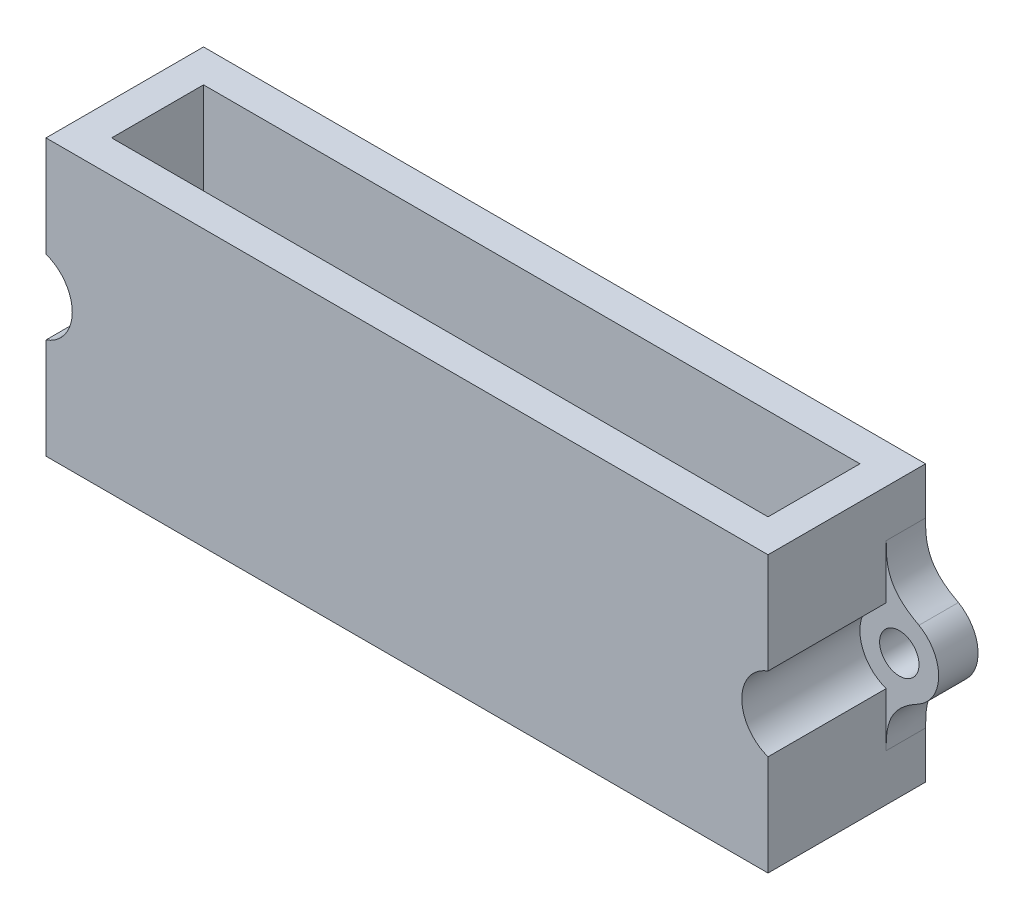
ISO-10303-21;
HEADER;
FILE_DESCRIPTION(('STEP AP214'),'2;1');
FILE_NAME('part.step','',(''),(''),'','','');
FILE_SCHEMA(('AUTOMOTIVE_DESIGN { 1 0 10303 214 1 1 1 1 }'));
ENDSEC;
DATA;
#1=APPLICATION_CONTEXT('core data for automotive mechanical design processes');
#2=APPLICATION_PROTOCOL_DEFINITION('international standard','automotive_design',2000,#1);
#3=PRODUCT_CONTEXT('',#1,'mechanical');
#4=PRODUCT('Part','Part','',(#3));
#5=PRODUCT_RELATED_PRODUCT_CATEGORY('part','',(#4));
#6=PRODUCT_DEFINITION_FORMATION('','',#4);
#7=PRODUCT_DEFINITION_CONTEXT('part definition',#1,'design');
#8=PRODUCT_DEFINITION('design','',#6,#7);
#9=PRODUCT_DEFINITION_SHAPE('','',#8);
#10=(LENGTH_UNIT() NAMED_UNIT(*) SI_UNIT(.MILLI.,.METRE.));
#11=(NAMED_UNIT(*) PLANE_ANGLE_UNIT() SI_UNIT($,.RADIAN.));
#12=(NAMED_UNIT(*) SI_UNIT($,.STERADIAN.) SOLID_ANGLE_UNIT());
#13=UNCERTAINTY_MEASURE_WITH_UNIT(LENGTH_MEASURE(1.E-05),#10,'distance_accuracy_value','');
#14=(GEOMETRIC_REPRESENTATION_CONTEXT(3) GLOBAL_UNCERTAINTY_ASSIGNED_CONTEXT((#13)) GLOBAL_UNIT_ASSIGNED_CONTEXT((#10,
#11,#12)) REPRESENTATION_CONTEXT('',''));
#15=CARTESIAN_POINT('',(0.,0.,0.));
#16=DIRECTION('',(0.,0.,1.));
#17=DIRECTION('',(1.,0.,0.));
#18=AXIS2_PLACEMENT_3D('',#15,#16,#17);
#19=CARTESIAN_POINT('',(28.5,0.,33.));
#20=DIRECTION('',(0.,0.,-1.));
#21=DIRECTION('',(-1.,0.,0.));
#22=AXIS2_PLACEMENT_3D('',#19,#20,#21);
#23=CYLINDRICAL_SURFACE('',#22,1.5);
#24=CARTESIAN_POINT('',(28.5,0.,0.));
#25=DIRECTION('',(0.,0.,1.));
#26=DIRECTION('',(1.,0.,0.));
#27=AXIS2_PLACEMENT_3D('',#24,#25,#26);
#28=CIRCLE('',#27,1.5);
#29=CARTESIAN_POINT('',(30.,0.,0.));
#30=VERTEX_POINT('',#29);
#31=EDGE_CURVE('E709',#30,#30,#28,.F.);
#32=ORIENTED_EDGE('',*,*,#31,.T.);
#33=EDGE_LOOP('',(#32));
#34=FACE_BOUND('',#33,.T.);
#35=CARTESIAN_POINT('',(28.5,0.,3.));
#36=DIRECTION('',(0.,0.,-1.));
#37=DIRECTION('',(-1.,0.,0.));
#38=AXIS2_PLACEMENT_3D('',#35,#36,#37);
#39=CIRCLE('',#38,1.5);
#40=CARTESIAN_POINT('',(27.,0.,3.));
#41=VERTEX_POINT('',#40);
#42=EDGE_CURVE('E724',#41,#41,#39,.F.);
#43=ORIENTED_EDGE('',*,*,#42,.T.);
#44=EDGE_LOOP('',(#43));
#45=FACE_BOUND('',#44,.T.);
#46=ADVANCED_FACE('F35',(#34,#45),#23,.F.);
#47=CARTESIAN_POINT('',(-28.5,0.,33.));
#48=DIRECTION('',(0.,0.,-1.));
#49=DIRECTION('',(-1.,0.,0.));
#50=AXIS2_PLACEMENT_3D('',#47,#48,#49);
#51=CYLINDRICAL_SURFACE('',#50,1.5);
#52=CARTESIAN_POINT('',(-28.5,0.,0.));
#53=DIRECTION('',(0.,0.,1.));
#54=DIRECTION('',(1.,0.,0.));
#55=AXIS2_PLACEMENT_3D('',#52,#53,#54);
#56=CIRCLE('',#55,1.5);
#57=CARTESIAN_POINT('',(-27.,0.,0.));
#58=VERTEX_POINT('',#57);
#59=EDGE_CURVE('E290',#58,#58,#56,.F.);
#60=ORIENTED_EDGE('',*,*,#59,.T.);
#61=EDGE_LOOP('',(#60));
#62=FACE_BOUND('',#61,.T.);
#63=CARTESIAN_POINT('',(-28.5,0.,3.));
#64=DIRECTION('',(0.,0.,-1.));
#65=DIRECTION('',(-1.,0.,0.));
#66=AXIS2_PLACEMENT_3D('',#63,#64,#65);
#67=CIRCLE('',#66,1.5);
#68=CARTESIAN_POINT('',(-30.,0.,3.));
#69=VERTEX_POINT('',#68);
#70=EDGE_CURVE('E277',#69,#69,#67,.F.);
#71=ORIENTED_EDGE('',*,*,#70,.T.);
#72=EDGE_LOOP('',(#71));
#73=FACE_BOUND('',#72,.T.);
#74=ADVANCED_FACE('F254',(#62,#73),#51,.F.);
#75=CARTESIAN_POINT('',(27.5,10.5,12.));
#76=DIRECTION('',(-1.,0.,0.));
#77=DIRECTION('',(0.,-1.,0.));
#78=AXIS2_PLACEMENT_3D('',#75,#76,#77);
#79=PLANE('',#78);
#80=DIRECTION('',(0.,1.,0.));
#81=VECTOR('',#80,1.);
#82=CARTESIAN_POINT('',(27.5,0.,3.));
#83=LINE('',#82,#81);
#84=CARTESIAN_POINT('',(27.5,2.82842712474619,3.));
#85=VERTEX_POINT('',#84);
#86=CARTESIAN_POINT('',(27.5,6.92820323027551,3.));
#87=VERTEX_POINT('',#86);
#88=EDGE_CURVE('E64',#85,#87,#83,.T.);
#89=ORIENTED_EDGE('',*,*,#88,.T.);
#90=CARTESIAN_POINT('',(27.5,6.92820323027551,-0.15));
#91=CARTESIAN_POINT('',(27.5,6.92820323027551,0.95));
#92=CARTESIAN_POINT('',(27.5,6.92820323027551,2.05000000000057));
#93=CARTESIAN_POINT('',(27.5,6.92820323027551,3.15));
#94=B_SPLINE_CURVE_WITH_KNOTS('',3,(#90,#91,#92,#93),.UNSPECIFIED.,.F.,.F.,(4,4),
(-0.000150000000000001,0.00315),.UNSPECIFIED.);
#95=CARTESIAN_POINT('',(27.5,6.92820323027551,0.));
#96=VERTEX_POINT('',#95);
#97=EDGE_CURVE('E276',#87,#96,#94,.F.);
#98=ORIENTED_EDGE('',*,*,#97,.T.);
#99=DIRECTION('',(0.,1.,0.));
#100=VECTOR('',#99,1.);
#101=CARTESIAN_POINT('',(27.5,10.5,0.));
#102=LINE('',#101,#100);
#103=CARTESIAN_POINT('',(27.5,10.5,0.));
#104=VERTEX_POINT('',#103);
#105=EDGE_CURVE('E220',#96,#104,#102,.T.);
#106=ORIENTED_EDGE('',*,*,#105,.T.);
#107=DIRECTION('',(0.,0.,-1.));
#108=VECTOR('',#107,1.);
#109=CARTESIAN_POINT('',(27.5,10.5,12.));
#110=LINE('',#109,#108);
#111=CARTESIAN_POINT('',(27.5,10.5,12.));
#112=VERTEX_POINT('',#111);
#113=EDGE_CURVE('E722',#112,#104,#110,.T.);
#114=ORIENTED_EDGE('',*,*,#113,.F.);
#115=DIRECTION('',(0.,1.,0.));
#116=VECTOR('',#115,1.);
#117=CARTESIAN_POINT('',(27.5,10.5,12.));
#118=LINE('',#117,#116);
#119=CARTESIAN_POINT('',(27.5,2.82842712474619,12.));
#120=VERTEX_POINT('',#119);
#121=EDGE_CURVE('E522',#120,#112,#118,.T.);
#122=ORIENTED_EDGE('',*,*,#121,.F.);
#123=DIRECTION('',(0.,0.,1.));
#124=VECTOR('',#123,1.);
#125=CARTESIAN_POINT('',(27.5,2.82842712474619,3.));
#126=LINE('',#125,#124);
#127=EDGE_CURVE('E200',#120,#85,#126,.F.);
#128=ORIENTED_EDGE('',*,*,#127,.T.);
#129=EDGE_LOOP('',(#89,#98,#106,#114,#122,#128));
#130=FACE_BOUND('',#129,.T.);
#131=ADVANCED_FACE('F243',(#130),#79,.F.);
#132=CARTESIAN_POINT('',(27.5,-10.5,0.));
#133=VERTEX_POINT('',#132);
#134=CARTESIAN_POINT('',(27.5,-6.92820323027548,0.));
#135=VERTEX_POINT('',#134);
#136=EDGE_CURVE('E224',#133,#135,#102,.T.);
#137=ORIENTED_EDGE('',*,*,#136,.T.);
#138=CARTESIAN_POINT('',(27.5,-6.92820323027551,3.15));
#139=CARTESIAN_POINT('',(27.5,-6.92820323027551,2.05000000000057));
#140=CARTESIAN_POINT('',(27.5,-6.92820323027551,0.95));
#141=CARTESIAN_POINT('',(27.5,-6.92820323027551,-0.15));
#142=B_SPLINE_CURVE_WITH_KNOTS('',3,(#138,#139,#140,#141),.UNSPECIFIED.,.F.,.F.,(4,4),
(-0.000150000000000001,0.00315),.UNSPECIFIED.);
#143=CARTESIAN_POINT('',(27.5,-6.92820323027551,3.));
#144=VERTEX_POINT('',#143);
#145=EDGE_CURVE('E236',#135,#144,#142,.F.);
#146=ORIENTED_EDGE('',*,*,#145,.T.);
#147=DIRECTION('',(0.,1.,0.));
#148=VECTOR('',#147,1.);
#149=CARTESIAN_POINT('',(27.5,0.,3.));
#150=LINE('',#149,#148);
#151=CARTESIAN_POINT('',(27.5,-2.82842712474619,3.));
#152=VERTEX_POINT('',#151);
#153=EDGE_CURVE('E241',#144,#152,#150,.T.);
#154=ORIENTED_EDGE('',*,*,#153,.T.);
#155=DIRECTION('',(0.,0.,1.));
#156=VECTOR('',#155,1.);
#157=CARTESIAN_POINT('',(27.5,-2.82842712474619,3.));
#158=LINE('',#157,#156);
#159=CARTESIAN_POINT('',(27.5,-2.82842712474619,12.));
#160=VERTEX_POINT('',#159);
#161=EDGE_CURVE('E715',#152,#160,#158,.T.);
#162=ORIENTED_EDGE('',*,*,#161,.T.);
#163=CARTESIAN_POINT('',(27.5,-10.5,12.));
#164=VERTEX_POINT('',#163);
#165=EDGE_CURVE('E520',#164,#160,#118,.T.);
#166=ORIENTED_EDGE('',*,*,#165,.F.);
#167=DIRECTION('',(0.,0.,-1.));
#168=VECTOR('',#167,1.);
#169=CARTESIAN_POINT('',(27.5,-10.5,12.));
#170=LINE('',#169,#168);
#171=EDGE_CURVE('E209',#164,#133,#170,.T.);
#172=ORIENTED_EDGE('',*,*,#171,.T.);
#173=EDGE_LOOP('',(#137,#146,#154,#162,#166,#172));
#174=FACE_BOUND('',#173,.T.);
#175=ADVANCED_FACE('F253',(#174),#79,.F.);
#176=CARTESIAN_POINT('',(-27.5,10.5,12.));
#177=DIRECTION('',(1.,0.,0.));
#178=DIRECTION('',(0.,1.,0.));
#179=AXIS2_PLACEMENT_3D('',#176,#177,#178);
#180=PLANE('',#179);
#181=DIRECTION('',(0.,-1.,0.));
#182=VECTOR('',#181,1.);
#183=CARTESIAN_POINT('',(-27.5,0.,3.));
#184=LINE('',#183,#182);
#185=CARTESIAN_POINT('',(-27.5,-2.82842712474619,3.));
#186=VERTEX_POINT('',#185);
#187=CARTESIAN_POINT('',(-27.5,-6.92820323027551,3.));
#188=VERTEX_POINT('',#187);
#189=EDGE_CURVE('E56',#186,#188,#184,.T.);
#190=ORIENTED_EDGE('',*,*,#189,.T.);
#191=CARTESIAN_POINT('',(-27.5,-6.92820323027551,-0.15));
#192=CARTESIAN_POINT('',(-27.5,-6.92820323027551,0.95));
#193=CARTESIAN_POINT('',(-27.5,-6.92820323027551,2.05000000000057));
#194=CARTESIAN_POINT('',(-27.5,-6.92820323027551,3.15));
#195=B_SPLINE_CURVE_WITH_KNOTS('',3,(#191,#192,#193,#194),.UNSPECIFIED.,.F.,.F.,(4,4),
(-0.000150000000000001,0.00315),.UNSPECIFIED.);
#196=CARTESIAN_POINT('',(-27.5,-6.92820323027549,0.));
#197=VERTEX_POINT('',#196);
#198=EDGE_CURVE('E358',#188,#197,#195,.F.);
#199=ORIENTED_EDGE('',*,*,#198,.T.);
#200=DIRECTION('',(0.,-1.,0.));
#201=VECTOR('',#200,1.);
#202=CARTESIAN_POINT('',(-27.5,10.5,0.));
#203=LINE('',#202,#201);
#204=CARTESIAN_POINT('',(-27.5,-10.5,0.));
#205=VERTEX_POINT('',#204);
#206=EDGE_CURVE('E345',#197,#205,#203,.T.);
#207=ORIENTED_EDGE('',*,*,#206,.T.);
#208=DIRECTION('',(0.,0.,-1.));
#209=VECTOR('',#208,1.);
#210=CARTESIAN_POINT('',(-27.5,-10.5,12.));
#211=LINE('',#210,#209);
#212=CARTESIAN_POINT('',(-27.5,-10.5,12.));
#213=VERTEX_POINT('',#212);
#214=EDGE_CURVE('E533',#213,#205,#211,.T.);
#215=ORIENTED_EDGE('',*,*,#214,.F.);
#216=DIRECTION('',(0.,-1.,0.));
#217=VECTOR('',#216,1.);
#218=CARTESIAN_POINT('',(-27.5,10.5,12.));
#219=LINE('',#218,#217);
#220=CARTESIAN_POINT('',(-27.5,-2.82842712474619,12.));
#221=VERTEX_POINT('',#220);
#222=EDGE_CURVE('E207',#221,#213,#219,.T.);
#223=ORIENTED_EDGE('',*,*,#222,.F.);
#224=DIRECTION('',(0.,0.,1.));
#225=VECTOR('',#224,1.);
#226=CARTESIAN_POINT('',(-27.5,-2.82842712474619,3.));
#227=LINE('',#226,#225);
#228=EDGE_CURVE('E184',#221,#186,#227,.F.);
#229=ORIENTED_EDGE('',*,*,#228,.T.);
#230=EDGE_LOOP('',(#190,#199,#207,#215,#223,#229));
#231=FACE_BOUND('',#230,.T.);
#232=ADVANCED_FACE('F362',(#231),#180,.F.);
#233=CARTESIAN_POINT('',(-27.5,10.5,0.));
#234=VERTEX_POINT('',#233);
#235=CARTESIAN_POINT('',(-27.5,6.92820323027551,0.));
#236=VERTEX_POINT('',#235);
#237=EDGE_CURVE('E337',#234,#236,#203,.T.);
#238=ORIENTED_EDGE('',*,*,#237,.T.);
#239=CARTESIAN_POINT('',(-27.5,6.92820323027551,3.15));
#240=CARTESIAN_POINT('',(-27.5,6.92820323027551,2.05000000000057));
#241=CARTESIAN_POINT('',(-27.5,6.92820323027551,0.95));
#242=CARTESIAN_POINT('',(-27.5,6.92820323027551,-0.15));
#243=B_SPLINE_CURVE_WITH_KNOTS('',3,(#239,#240,#241,#242),.UNSPECIFIED.,.F.,.F.,(4,4),
(-0.000150000000000001,0.00315),.UNSPECIFIED.);
#244=CARTESIAN_POINT('',(-27.5,6.92820323027551,3.));
#245=VERTEX_POINT('',#244);
#246=EDGE_CURVE('E383',#236,#245,#243,.F.);
#247=ORIENTED_EDGE('',*,*,#246,.T.);
#248=DIRECTION('',(0.,-1.,0.));
#249=VECTOR('',#248,1.);
#250=CARTESIAN_POINT('',(-27.5,0.,3.));
#251=LINE('',#250,#249);
#252=CARTESIAN_POINT('',(-27.5,2.82842712474619,3.));
#253=VERTEX_POINT('',#252);
#254=EDGE_CURVE('E199',#245,#253,#251,.T.);
#255=ORIENTED_EDGE('',*,*,#254,.T.);
#256=DIRECTION('',(0.,0.,1.));
#257=VECTOR('',#256,1.);
#258=CARTESIAN_POINT('',(-27.5,2.82842712474619,3.));
#259=LINE('',#258,#257);
#260=CARTESIAN_POINT('',(-27.5,2.82842712474619,12.));
#261=VERTEX_POINT('',#260);
#262=EDGE_CURVE('E183',#253,#261,#259,.T.);
#263=ORIENTED_EDGE('',*,*,#262,.T.);
#264=CARTESIAN_POINT('',(-27.5,10.5,12.));
#265=VERTEX_POINT('',#264);
#266=EDGE_CURVE('E196',#265,#261,#219,.T.);
#267=ORIENTED_EDGE('',*,*,#266,.F.);
#268=DIRECTION('',(0.,0.,-1.));
#269=VECTOR('',#268,1.);
#270=CARTESIAN_POINT('',(-27.5,10.5,12.));
#271=LINE('',#270,#269);
#272=EDGE_CURVE('E463',#265,#234,#271,.T.);
#273=ORIENTED_EDGE('',*,*,#272,.T.);
#274=EDGE_LOOP('',(#238,#247,#255,#263,#267,#273));
#275=FACE_BOUND('',#274,.T.);
#276=ADVANCED_FACE('F194',(#275),#180,.F.);
#277=CARTESIAN_POINT('',(-27.5,10.5,12.));
#278=DIRECTION('',(0.,-1.,0.));
#279=DIRECTION('',(0.,0.,-1.));
#280=AXIS2_PLACEMENT_3D('',#277,#278,#279);
#281=PLANE('',#280);
#282=DIRECTION('',(-1.,0.,0.));
#283=VECTOR('',#282,1.);
#284=CARTESIAN_POINT('',(-27.5,10.5,0.));
#285=LINE('',#284,#283);
#286=EDGE_CURVE('E216',#104,#234,#285,.T.);
#287=ORIENTED_EDGE('',*,*,#286,.T.);
#288=ORIENTED_EDGE('',*,*,#272,.F.);
#289=DIRECTION('',(-1.,0.,0.));
#290=VECTOR('',#289,1.);
#291=CARTESIAN_POINT('',(-27.5,10.5,12.));
#292=LINE('',#291,#290);
#293=EDGE_CURVE('E204',#112,#265,#292,.T.);
#294=ORIENTED_EDGE('',*,*,#293,.F.);
#295=ORIENTED_EDGE('',*,*,#113,.T.);
#296=EDGE_LOOP('',(#287,#288,#294,#295));
#297=FACE_BOUND('',#296,.T.);
#298=DIRECTION('',(-1.,0.,0.));
#299=VECTOR('',#298,1.);
#300=CARTESIAN_POINT('',(-27.5,10.5,2.5));
#301=LINE('',#300,#299);
#302=CARTESIAN_POINT('',(25.,10.5,2.5));
#303=VERTEX_POINT('',#302);
#304=CARTESIAN_POINT('',(-25.,10.5,2.5));
#305=VERTEX_POINT('',#304);
#306=EDGE_CURVE('E514',#303,#305,#301,.T.);
#307=ORIENTED_EDGE('',*,*,#306,.F.);
#308=DIRECTION('',(0.,0.,-1.));
#309=VECTOR('',#308,1.);
#310=CARTESIAN_POINT('',(25.,10.5,12.));
#311=LINE('',#310,#309);
#312=CARTESIAN_POINT('',(25.,10.5,9.5));
#313=VERTEX_POINT('',#312);
#314=EDGE_CURVE('E500',#313,#303,#311,.T.);
#315=ORIENTED_EDGE('',*,*,#314,.F.);
#316=DIRECTION('',(-1.,0.,0.));
#317=VECTOR('',#316,1.);
#318=CARTESIAN_POINT('',(-27.5,10.5,9.5));
#319=LINE('',#318,#317);
#320=CARTESIAN_POINT('',(-25.,10.5,9.5));
#321=VERTEX_POINT('',#320);
#322=EDGE_CURVE('E517',#313,#321,#319,.T.);
#323=ORIENTED_EDGE('',*,*,#322,.T.);
#324=DIRECTION('',(0.,0.,-1.));
#325=VECTOR('',#324,1.);
#326=CARTESIAN_POINT('',(-25.,10.5,12.));
#327=LINE('',#326,#325);
#328=EDGE_CURVE('E501',#321,#305,#327,.T.);
#329=ORIENTED_EDGE('',*,*,#328,.T.);
#330=EDGE_LOOP('',(#307,#315,#323,#329));
#331=FACE_BOUND('',#330,.T.);
#332=ADVANCED_FACE('F256',(#297,#331),#281,.F.);
#333=CARTESIAN_POINT('',(-27.5,-10.5,12.));
#334=DIRECTION('',(0.,1.,0.));
#335=DIRECTION('',(0.,0.,1.));
#336=AXIS2_PLACEMENT_3D('',#333,#334,#335);
#337=PLANE('',#336);
#338=DIRECTION('',(1.,0.,0.));
#339=VECTOR('',#338,1.);
#340=CARTESIAN_POINT('',(-27.5,-10.5,0.));
#341=LINE('',#340,#339);
#342=EDGE_CURVE('E344',#205,#133,#341,.T.);
#343=ORIENTED_EDGE('',*,*,#342,.T.);
#344=ORIENTED_EDGE('',*,*,#171,.F.);
#345=DIRECTION('',(1.,0.,0.));
#346=VECTOR('',#345,1.);
#347=CARTESIAN_POINT('',(-27.5,-10.5,12.));
#348=LINE('',#347,#346);
#349=EDGE_CURVE('E206',#213,#164,#348,.T.);
#350=ORIENTED_EDGE('',*,*,#349,.F.);
#351=ORIENTED_EDGE('',*,*,#214,.T.);
#352=EDGE_LOOP('',(#343,#344,#350,#351));
#353=FACE_BOUND('',#352,.T.);
#354=ADVANCED_FACE('F371',(#353),#337,.F.);
#355=CARTESIAN_POINT('',(0.,0.,12.));
#356=DIRECTION('',(0.,0.,1.));
#357=DIRECTION('',(1.,0.,0.));
#358=AXIS2_PLACEMENT_3D('',#355,#356,#357);
#359=PLANE('',#358);
#360=CARTESIAN_POINT('',(-28.5,0.,12.));
#361=DIRECTION('',(0.,0.,1.));
#362=DIRECTION('',(1.,0.,0.));
#363=AXIS2_PLACEMENT_3D('',#360,#361,#362);
#364=CIRCLE('',#363,3.);
#365=EDGE_CURVE('E179',#221,#261,#364,.T.);
#366=ORIENTED_EDGE('',*,*,#365,.F.);
#367=ORIENTED_EDGE('',*,*,#222,.T.);
#368=ORIENTED_EDGE('',*,*,#349,.T.);
#369=ORIENTED_EDGE('',*,*,#165,.T.);
#370=CARTESIAN_POINT('',(28.5,0.,12.));
#371=DIRECTION('',(0.,0.,1.));
#372=DIRECTION('',(1.,0.,0.));
#373=AXIS2_PLACEMENT_3D('',#370,#371,#372);
#374=CIRCLE('',#373,3.);
#375=EDGE_CURVE('E717',#120,#160,#374,.T.);
#376=ORIENTED_EDGE('',*,*,#375,.F.);
#377=ORIENTED_EDGE('',*,*,#121,.T.);
#378=ORIENTED_EDGE('',*,*,#293,.T.);
#379=ORIENTED_EDGE('',*,*,#266,.T.);
#380=EDGE_LOOP('',(#366,#367,#368,#369,#376,#377,#378,#379));
#381=FACE_BOUND('',#380,.T.);
#382=ADVANCED_FACE('F202',(#381),#359,.T.);
#383=CARTESIAN_POINT('',(0.,0.,0.));
#384=DIRECTION('',(0.,0.,1.));
#385=DIRECTION('',(1.,0.,0.));
#386=AXIS2_PLACEMENT_3D('',#383,#384,#385);
#387=PLANE('',#386);
#388=ORIENTED_EDGE('',*,*,#59,.F.);
#389=EDGE_LOOP('',(#388));
#390=FACE_BOUND('',#389,.T.);
#391=ORIENTED_EDGE('',*,*,#31,.F.);
#392=EDGE_LOOP('',(#391));
#393=FACE_BOUND('',#392,.T.);
#394=ORIENTED_EDGE('',*,*,#105,.F.);
#395=CARTESIAN_POINT('',(30.,2.59807621135331,0.));
#396=CARTESIAN_POINT('',(29.735280721567,2.75091195801629,0.));
#397=CARTESIAN_POINT('',(29.3256548388154,2.9424556066062,0.));
#398=CARTESIAN_POINT('',(28.1085936877171,3.77587262672935,0.));
#399=CARTESIAN_POINT('',(27.6226006615,4.82991493936676,0.));
#400=CARTESIAN_POINT('',(27.5,5.89230484541326,0.));
#401=CARTESIAN_POINT('',(27.5,6.41025403784438,0.));
#402=CARTESIAN_POINT('',(27.5,6.92820323027551,0.));
#403=B_SPLINE_CURVE_WITH_KNOTS('',5,(#395,#396,#397,#398,#399,#400,#401,#402),.UNSPECIFIED.,.F.,
.F.,(6,2,6),(0.,0.5,1.),.UNSPECIFIED.);
#404=CARTESIAN_POINT('',(30.,2.59807621135331,0.));
#405=VERTEX_POINT('',#404);
#406=EDGE_CURVE('E391',#96,#405,#403,.F.);
#407=ORIENTED_EDGE('',*,*,#406,.T.);
#408=CARTESIAN_POINT('',(28.5,0.,0.));
#409=DIRECTION('',(0.,0.,-1.));
#410=DIRECTION('',(-1.,0.,0.));
#411=AXIS2_PLACEMENT_3D('',#408,#409,#410);
#412=CIRCLE('',#411,3.);
#413=CARTESIAN_POINT('',(30.,-2.59807621135331,0.));
#414=VERTEX_POINT('',#413);
#415=EDGE_CURVE('E285',#405,#414,#412,.T.);
#416=ORIENTED_EDGE('',*,*,#415,.T.);
#417=CARTESIAN_POINT('',(27.5,-6.92820323027551,0.));
#418=CARTESIAN_POINT('',(27.5,-6.41025403784438,0.));
#419=CARTESIAN_POINT('',(27.5,-5.89230484541326,0.));
#420=CARTESIAN_POINT('',(27.6226006615,-4.82991493936676,0.));
#421=CARTESIAN_POINT('',(28.1085936877171,-3.77587262672935,0.));
#422=CARTESIAN_POINT('',(29.3256548388154,-2.9424556066062,0.));
#423=CARTESIAN_POINT('',(29.735280721567,-2.75091195801629,0.));
#424=CARTESIAN_POINT('',(30.,-2.59807621135331,0.));
#425=B_SPLINE_CURVE_WITH_KNOTS('',5,(#417,#418,#419,#420,#421,#422,#423,#424),.UNSPECIFIED.,.F.,
.F.,(6,2,6),(0.,0.5,1.),.UNSPECIFIED.);
#426=EDGE_CURVE('E536',#414,#135,#425,.F.);
#427=ORIENTED_EDGE('',*,*,#426,.T.);
#428=ORIENTED_EDGE('',*,*,#136,.F.);
#429=ORIENTED_EDGE('',*,*,#342,.F.);
#430=ORIENTED_EDGE('',*,*,#206,.F.);
#431=CARTESIAN_POINT('',(-30.,-2.59807621135332,0.));
#432=CARTESIAN_POINT('',(-29.735280721567,-2.75091195801629,0.));
#433=CARTESIAN_POINT('',(-29.3256548388154,-2.9424556066062,0.));
#434=CARTESIAN_POINT('',(-28.1085936877171,-3.77587262672935,0.));
#435=CARTESIAN_POINT('',(-27.6226006615,-4.82991493936676,0.));
#436=CARTESIAN_POINT('',(-27.5,-5.89230484541326,0.));
#437=CARTESIAN_POINT('',(-27.5,-6.41025403784439,0.));
#438=CARTESIAN_POINT('',(-27.5,-6.92820323027551,0.));
#439=B_SPLINE_CURVE_WITH_KNOTS('',5,(#431,#432,#433,#434,#435,#436,#437,#438),.UNSPECIFIED.,.F.,
.F.,(6,2,6),(0.,0.5,1.),.UNSPECIFIED.);
#440=CARTESIAN_POINT('',(-30.,-2.59807621135331,0.));
#441=VERTEX_POINT('',#440);
#442=EDGE_CURVE('E428',#197,#441,#439,.F.);
#443=ORIENTED_EDGE('',*,*,#442,.T.);
#444=CARTESIAN_POINT('',(-28.5,0.,0.));
#445=DIRECTION('',(0.,0.,-1.));
#446=DIRECTION('',(-1.,0.,0.));
#447=AXIS2_PLACEMENT_3D('',#444,#445,#446);
#448=CIRCLE('',#447,3.);
#449=CARTESIAN_POINT('',(-30.,2.59807621135331,0.));
#450=VERTEX_POINT('',#449);
#451=EDGE_CURVE('E284',#441,#450,#448,.T.);
#452=ORIENTED_EDGE('',*,*,#451,.T.);
#453=CARTESIAN_POINT('',(-27.5,6.92820323027551,0.));
#454=CARTESIAN_POINT('',(-27.5,6.41025403784439,0.));
#455=CARTESIAN_POINT('',(-27.5,5.89230484541326,0.));
#456=CARTESIAN_POINT('',(-27.6226006615,4.82991493936676,0.));
#457=CARTESIAN_POINT('',(-28.1085936877171,3.77587262672935,0.));
#458=CARTESIAN_POINT('',(-29.3256548388154,2.9424556066062,0.));
#459=CARTESIAN_POINT('',(-29.735280721567,2.75091195801629,0.));
#460=CARTESIAN_POINT('',(-30.,2.59807621135332,0.));
#461=B_SPLINE_CURVE_WITH_KNOTS('',5,(#453,#454,#455,#456,#457,#458,#459,#460),.UNSPECIFIED.,.F.,
.F.,(6,2,6),(0.,0.5,1.),.UNSPECIFIED.);
#462=EDGE_CURVE('E11',#450,#236,#461,.F.);
#463=ORIENTED_EDGE('',*,*,#462,.T.);
#464=ORIENTED_EDGE('',*,*,#237,.F.);
#465=ORIENTED_EDGE('',*,*,#286,.F.);
#466=EDGE_LOOP('',(#394,#407,#416,#427,#428,#429,#430,#443,#452,#463,#464,#465));
#467=FACE_BOUND('',#466,.T.);
#468=ADVANCED_FACE('F397',(#390,#393,#467),#387,.F.);
#469=CARTESIAN_POINT('',(25.,10.5,12.));
#470=DIRECTION('',(-1.,0.,0.));
#471=DIRECTION('',(0.,-1.,0.));
#472=AXIS2_PLACEMENT_3D('',#469,#470,#471);
#473=PLANE('',#472);
#474=DIRECTION('',(0.,1.,0.));
#475=VECTOR('',#474,1.);
#476=CARTESIAN_POINT('',(25.,10.5,2.5));
#477=LINE('',#476,#475);
#478=CARTESIAN_POINT('',(25.,-8.,2.5));
#479=VERTEX_POINT('',#478);
#480=EDGE_CURVE('E303',#479,#303,#477,.T.);
#481=ORIENTED_EDGE('',*,*,#480,.F.);
#482=DIRECTION('',(0.,0.,-1.));
#483=VECTOR('',#482,1.);
#484=CARTESIAN_POINT('',(25.,-8.,12.));
#485=LINE('',#484,#483);
#486=CARTESIAN_POINT('',(25.,-8.,9.5));
#487=VERTEX_POINT('',#486);
#488=EDGE_CURVE('E747',#487,#479,#485,.T.);
#489=ORIENTED_EDGE('',*,*,#488,.F.);
#490=DIRECTION('',(0.,1.,0.));
#491=VECTOR('',#490,1.);
#492=CARTESIAN_POINT('',(25.,10.5,9.5));
#493=LINE('',#492,#491);
#494=EDGE_CURVE('E519',#487,#313,#493,.T.);
#495=ORIENTED_EDGE('',*,*,#494,.T.);
#496=ORIENTED_EDGE('',*,*,#314,.T.);
#497=EDGE_LOOP('',(#481,#489,#495,#496));
#498=FACE_BOUND('',#497,.T.);
#499=ADVANCED_FACE('F331',(#498),#473,.T.);
#500=CARTESIAN_POINT('',(-25.,10.5,12.));
#501=DIRECTION('',(1.,0.,0.));
#502=DIRECTION('',(0.,1.,0.));
#503=AXIS2_PLACEMENT_3D('',#500,#501,#502);
#504=PLANE('',#503);
#505=DIRECTION('',(0.,-1.,0.));
#506=VECTOR('',#505,1.);
#507=CARTESIAN_POINT('',(-25.,10.5,2.5));
#508=LINE('',#507,#506);
#509=CARTESIAN_POINT('',(-25.,-8.,2.5));
#510=VERTEX_POINT('',#509);
#511=EDGE_CURVE('E515',#305,#510,#508,.T.);
#512=ORIENTED_EDGE('',*,*,#511,.F.);
#513=ORIENTED_EDGE('',*,*,#328,.F.);
#514=DIRECTION('',(0.,-1.,0.));
#515=VECTOR('',#514,1.);
#516=CARTESIAN_POINT('',(-25.,10.5,9.5));
#517=LINE('',#516,#515);
#518=CARTESIAN_POINT('',(-25.,-8.,9.5));
#519=VERTEX_POINT('',#518);
#520=EDGE_CURVE('E512',#321,#519,#517,.T.);
#521=ORIENTED_EDGE('',*,*,#520,.T.);
#522=DIRECTION('',(0.,0.,-1.));
#523=VECTOR('',#522,1.);
#524=CARTESIAN_POINT('',(-25.,-8.,12.));
#525=LINE('',#524,#523);
#526=EDGE_CURVE('E508',#519,#510,#525,.T.);
#527=ORIENTED_EDGE('',*,*,#526,.T.);
#528=EDGE_LOOP('',(#512,#513,#521,#527));
#529=FACE_BOUND('',#528,.T.);
#530=ADVANCED_FACE('F739',(#529),#504,.T.);
#531=CARTESIAN_POINT('',(-27.5,-8.,12.));
#532=DIRECTION('',(0.,1.,0.));
#533=DIRECTION('',(0.,0.,1.));
#534=AXIS2_PLACEMENT_3D('',#531,#532,#533);
#535=PLANE('',#534);
#536=DIRECTION('',(1.,0.,0.));
#537=VECTOR('',#536,1.);
#538=CARTESIAN_POINT('',(-27.5,-8.,2.5));
#539=LINE('',#538,#537);
#540=EDGE_CURVE('E743',#510,#479,#539,.T.);
#541=ORIENTED_EDGE('',*,*,#540,.F.);
#542=ORIENTED_EDGE('',*,*,#526,.F.);
#543=DIRECTION('',(1.,0.,0.));
#544=VECTOR('',#543,1.);
#545=CARTESIAN_POINT('',(-27.5,-8.,9.5));
#546=LINE('',#545,#544);
#547=EDGE_CURVE('E748',#519,#487,#546,.T.);
#548=ORIENTED_EDGE('',*,*,#547,.T.);
#549=ORIENTED_EDGE('',*,*,#488,.T.);
#550=EDGE_LOOP('',(#541,#542,#548,#549));
#551=FACE_BOUND('',#550,.T.);
#552=ADVANCED_FACE('F758',(#551),#535,.T.);
#553=CARTESIAN_POINT('',(0.,0.,9.5));
#554=DIRECTION('',(0.,0.,1.));
#555=DIRECTION('',(1.,0.,0.));
#556=AXIS2_PLACEMENT_3D('',#553,#554,#555);
#557=PLANE('',#556);
#558=ORIENTED_EDGE('',*,*,#494,.F.);
#559=ORIENTED_EDGE('',*,*,#547,.F.);
#560=ORIENTED_EDGE('',*,*,#520,.F.);
#561=ORIENTED_EDGE('',*,*,#322,.F.);
#562=EDGE_LOOP('',(#558,#559,#560,#561));
#563=FACE_BOUND('',#562,.T.);
#564=ADVANCED_FACE('F658',(#563),#557,.F.);
#565=CARTESIAN_POINT('',(0.,0.,2.5));
#566=DIRECTION('',(0.,0.,1.));
#567=DIRECTION('',(1.,0.,0.));
#568=AXIS2_PLACEMENT_3D('',#565,#566,#567);
#569=PLANE('',#568);
#570=ORIENTED_EDGE('',*,*,#480,.T.);
#571=ORIENTED_EDGE('',*,*,#306,.T.);
#572=ORIENTED_EDGE('',*,*,#511,.T.);
#573=ORIENTED_EDGE('',*,*,#540,.T.);
#574=EDGE_LOOP('',(#570,#571,#572,#573));
#575=FACE_BOUND('',#574,.T.);
#576=ADVANCED_FACE('F653',(#575),#569,.T.);
#577=CARTESIAN_POINT('',(-28.5,0.,3.));
#578=DIRECTION('',(0.,0.,-1.));
#579=DIRECTION('',(-1.,0.,0.));
#580=AXIS2_PLACEMENT_3D('',#577,#578,#579);
#581=PLANE('',#580);
#582=ORIENTED_EDGE('',*,*,#70,.F.);
#583=EDGE_LOOP('',(#582));
#584=FACE_BOUND('',#583,.T.);
#585=CARTESIAN_POINT('',(-28.5,0.,3.));
#586=DIRECTION('',(0.,0.,-1.));
#587=DIRECTION('',(-1.,0.,0.));
#588=AXIS2_PLACEMENT_3D('',#585,#586,#587);
#589=CIRCLE('',#588,3.);
#590=CARTESIAN_POINT('',(-30.,-2.59807621135332,3.));
#591=VERTEX_POINT('',#590);
#592=CARTESIAN_POINT('',(-30.,2.59807621135332,3.));
#593=VERTEX_POINT('',#592);
#594=EDGE_CURVE('E299',#591,#593,#589,.T.);
#595=ORIENTED_EDGE('',*,*,#594,.F.);
#596=CARTESIAN_POINT('',(-27.5,-6.92820323027551,3.));
#597=CARTESIAN_POINT('',(-27.5,-6.41025403784439,3.));
#598=CARTESIAN_POINT('',(-27.5,-5.89230484541326,3.));
#599=CARTESIAN_POINT('',(-27.6226006615,-4.82991493936676,3.));
#600=CARTESIAN_POINT('',(-28.1085936877171,-3.77587262672935,3.));
#601=CARTESIAN_POINT('',(-29.3256548388154,-2.9424556066062,3.));
#602=CARTESIAN_POINT('',(-29.735280721567,-2.75091195801629,3.));
#603=CARTESIAN_POINT('',(-30.,-2.59807621135332,3.));
#604=B_SPLINE_CURVE_WITH_KNOTS('',5,(#596,#597,#598,#599,#600,#601,#602,#603),.UNSPECIFIED.,.F.,
.F.,(6,2,6),(0.,0.5,1.),.UNSPECIFIED.);
#605=EDGE_CURVE('E440',#591,#188,#604,.F.);
#606=ORIENTED_EDGE('',*,*,#605,.T.);
#607=ORIENTED_EDGE('',*,*,#189,.F.);
#608=CARTESIAN_POINT('',(-28.5,0.,3.));
#609=DIRECTION('',(0.,0.,1.));
#610=DIRECTION('',(1.,0.,0.));
#611=AXIS2_PLACEMENT_3D('',#608,#609,#610);
#612=CIRCLE('',#611,3.);
#613=EDGE_CURVE('E188',#186,#253,#612,.T.);
#614=ORIENTED_EDGE('',*,*,#613,.T.);
#615=ORIENTED_EDGE('',*,*,#254,.F.);
#616=CARTESIAN_POINT('',(-30.,2.59807621135332,3.));
#617=CARTESIAN_POINT('',(-29.735280721567,2.75091195801629,3.));
#618=CARTESIAN_POINT('',(-29.3256548388154,2.9424556066062,3.));
#619=CARTESIAN_POINT('',(-28.1085936877171,3.77587262672935,3.));
#620=CARTESIAN_POINT('',(-27.6226006615,4.82991493936676,3.));
#621=CARTESIAN_POINT('',(-27.5,5.89230484541326,3.));
#622=CARTESIAN_POINT('',(-27.5,6.41025403784439,3.));
#623=CARTESIAN_POINT('',(-27.5,6.92820323027551,3.));
#624=B_SPLINE_CURVE_WITH_KNOTS('',5,(#616,#617,#618,#619,#620,#621,#622,#623),.UNSPECIFIED.,.F.,
.F.,(6,2,6),(0.,0.5,1.),.UNSPECIFIED.);
#625=EDGE_CURVE('E49',#245,#593,#624,.F.);
#626=ORIENTED_EDGE('',*,*,#625,.T.);
#627=EDGE_LOOP('',(#595,#606,#607,#614,#615,#626));
#628=FACE_BOUND('',#627,.T.);
#629=ADVANCED_FACE('F329',(#584,#628),#581,.F.);
#630=CARTESIAN_POINT('',(-28.5,0.,3.));
#631=DIRECTION('',(0.,0.,-1.));
#632=DIRECTION('',(-1.,0.,0.));
#633=AXIS2_PLACEMENT_3D('',#630,#631,#632);
#634=CYLINDRICAL_SURFACE('',#633,3.);
#635=ORIENTED_EDGE('',*,*,#451,.F.);
#636=CARTESIAN_POINT('',(-30.,-2.59807621135332,3.15));
#637=CARTESIAN_POINT('',(-30.,-2.59807621135332,2.05000000000057));
#638=CARTESIAN_POINT('',(-30.,-2.59807621135332,0.95));
#639=CARTESIAN_POINT('',(-30.,-2.59807621135332,-0.15));
#640=B_SPLINE_CURVE_WITH_KNOTS('',3,(#636,#637,#638,#639),.UNSPECIFIED.,.F.,.F.,(4,4),
(-0.000150000000000001,0.00315),.UNSPECIFIED.);
#641=EDGE_CURVE('E384',#441,#591,#640,.F.);
#642=ORIENTED_EDGE('',*,*,#641,.T.);
#643=ORIENTED_EDGE('',*,*,#594,.T.);
#644=CARTESIAN_POINT('',(-30.,2.59807621135332,-0.15));
#645=CARTESIAN_POINT('',(-30.,2.59807621135332,0.95));
#646=CARTESIAN_POINT('',(-30.,2.59807621135332,2.05000000000057));
#647=CARTESIAN_POINT('',(-30.,2.59807621135332,3.15));
#648=B_SPLINE_CURVE_WITH_KNOTS('',3,(#644,#645,#646,#647),.UNSPECIFIED.,.F.,.F.,(4,4),
(-0.000150000000000001,0.00315),.UNSPECIFIED.);
#649=EDGE_CURVE('E312',#593,#450,#648,.F.);
#650=ORIENTED_EDGE('',*,*,#649,.T.);
#651=EDGE_LOOP('',(#635,#642,#643,#650));
#652=FACE_BOUND('',#651,.T.);
#653=ADVANCED_FACE('F318',(#652),#634,.T.);
#654=CARTESIAN_POINT('',(28.5,0.,3.));
#655=DIRECTION('',(0.,0.,-1.));
#656=DIRECTION('',(-1.,0.,0.));
#657=AXIS2_PLACEMENT_3D('',#654,#655,#656);
#658=PLANE('',#657);
#659=ORIENTED_EDGE('',*,*,#42,.F.);
#660=EDGE_LOOP('',(#659));
#661=FACE_BOUND('',#660,.T.);
#662=CARTESIAN_POINT('',(28.5,0.,3.));
#663=DIRECTION('',(0.,0.,-1.));
#664=DIRECTION('',(-1.,0.,0.));
#665=AXIS2_PLACEMENT_3D('',#662,#663,#664);
#666=CIRCLE('',#665,3.);
#667=CARTESIAN_POINT('',(30.,2.59807621135331,3.));
#668=VERTEX_POINT('',#667);
#669=CARTESIAN_POINT('',(30.,-2.59807621135331,3.));
#670=VERTEX_POINT('',#669);
#671=EDGE_CURVE('E280',#668,#670,#666,.T.);
#672=ORIENTED_EDGE('',*,*,#671,.F.);
#673=CARTESIAN_POINT('',(27.5,6.92820323027551,3.));
#674=CARTESIAN_POINT('',(27.5,6.41025403784438,3.));
#675=CARTESIAN_POINT('',(27.5,5.89230484541326,3.));
#676=CARTESIAN_POINT('',(27.6226006615,4.82991493936676,3.));
#677=CARTESIAN_POINT('',(28.1085936877171,3.77587262672935,3.));
#678=CARTESIAN_POINT('',(29.3256548388154,2.9424556066062,3.));
#679=CARTESIAN_POINT('',(29.735280721567,2.75091195801629,3.));
#680=CARTESIAN_POINT('',(30.,2.59807621135331,3.));
#681=B_SPLINE_CURVE_WITH_KNOTS('',5,(#673,#674,#675,#676,#677,#678,#679,#680),.UNSPECIFIED.,.F.,
.F.,(6,2,6),(0.,0.5,1.),.UNSPECIFIED.);
#682=EDGE_CURVE('E540',#668,#87,#681,.F.);
#683=ORIENTED_EDGE('',*,*,#682,.T.);
#684=ORIENTED_EDGE('',*,*,#88,.F.);
#685=CARTESIAN_POINT('',(28.5,0.,3.));
#686=DIRECTION('',(0.,0.,1.));
#687=DIRECTION('',(1.,0.,0.));
#688=AXIS2_PLACEMENT_3D('',#685,#686,#687);
#689=CIRCLE('',#688,3.);
#690=EDGE_CURVE('E189',#85,#152,#689,.T.);
#691=ORIENTED_EDGE('',*,*,#690,.T.);
#692=ORIENTED_EDGE('',*,*,#153,.F.);
#693=CARTESIAN_POINT('',(30.,-2.59807621135331,3.));
#694=CARTESIAN_POINT('',(29.735280721567,-2.75091195801629,3.));
#695=CARTESIAN_POINT('',(29.3256548388154,-2.9424556066062,3.));
#696=CARTESIAN_POINT('',(28.1085936877171,-3.77587262672935,3.));
#697=CARTESIAN_POINT('',(27.6226006615,-4.82991493936676,3.));
#698=CARTESIAN_POINT('',(27.5,-5.89230484541326,3.));
#699=CARTESIAN_POINT('',(27.5,-6.41025403784439,3.));
#700=CARTESIAN_POINT('',(27.5,-6.92820323027551,3.));
#701=B_SPLINE_CURVE_WITH_KNOTS('',5,(#693,#694,#695,#696,#697,#698,#699,#700),.UNSPECIFIED.,.F.,
.F.,(6,2,6),(0.,0.5,1.),.UNSPECIFIED.);
#702=EDGE_CURVE('E539',#144,#670,#701,.F.);
#703=ORIENTED_EDGE('',*,*,#702,.T.);
#704=EDGE_LOOP('',(#672,#683,#684,#691,#692,#703));
#705=FACE_BOUND('',#704,.T.);
#706=ADVANCED_FACE('F328',(#661,#705),#658,.F.);
#707=CARTESIAN_POINT('',(28.5,0.,3.));
#708=DIRECTION('',(0.,0.,-1.));
#709=DIRECTION('',(-1.,0.,0.));
#710=AXIS2_PLACEMENT_3D('',#707,#708,#709);
#711=CYLINDRICAL_SURFACE('',#710,3.);
#712=ORIENTED_EDGE('',*,*,#415,.F.);
#713=CARTESIAN_POINT('',(30.,2.59807621135331,3.15));
#714=CARTESIAN_POINT('',(30.,2.59807621135331,2.05000000000057));
#715=CARTESIAN_POINT('',(30.,2.59807621135331,0.95));
#716=CARTESIAN_POINT('',(30.,2.59807621135331,-0.15));
#717=B_SPLINE_CURVE_WITH_KNOTS('',3,(#713,#714,#715,#716),.UNSPECIFIED.,.F.,.F.,(4,4),
(-0.000150000000000001,0.00315),.UNSPECIFIED.);
#718=EDGE_CURVE('E485',#405,#668,#717,.F.);
#719=ORIENTED_EDGE('',*,*,#718,.T.);
#720=ORIENTED_EDGE('',*,*,#671,.T.);
#721=CARTESIAN_POINT('',(30.,-2.59807621135331,-0.15));
#722=CARTESIAN_POINT('',(30.,-2.59807621135331,0.95));
#723=CARTESIAN_POINT('',(30.,-2.59807621135331,2.05000000000057));
#724=CARTESIAN_POINT('',(30.,-2.59807621135331,3.15));
#725=B_SPLINE_CURVE_WITH_KNOTS('',3,(#721,#722,#723,#724),.UNSPECIFIED.,.F.,.F.,(4,4),
(-0.000150000000000001,0.00315),.UNSPECIFIED.);
#726=EDGE_CURVE('E489',#670,#414,#725,.F.);
#727=ORIENTED_EDGE('',*,*,#726,.T.);
#728=EDGE_LOOP('',(#712,#719,#720,#727));
#729=FACE_BOUND('',#728,.T.);
#730=ADVANCED_FACE('F675',(#729),#711,.T.);
#731=CARTESIAN_POINT('',(-28.5,0.,3.));
#732=DIRECTION('',(0.,0.,1.));
#733=DIRECTION('',(1.,0.,0.));
#734=AXIS2_PLACEMENT_3D('',#731,#732,#733);
#735=CYLINDRICAL_SURFACE('',#734,3.);
#736=ORIENTED_EDGE('',*,*,#365,.T.);
#737=ORIENTED_EDGE('',*,*,#262,.F.);
#738=ORIENTED_EDGE('',*,*,#613,.F.);
#739=ORIENTED_EDGE('',*,*,#228,.F.);
#740=EDGE_LOOP('',(#736,#737,#738,#739));
#741=FACE_BOUND('',#740,.T.);
#742=ADVANCED_FACE('F181',(#741),#735,.F.);
#743=CARTESIAN_POINT('',(28.5,0.,3.));
#744=DIRECTION('',(0.,0.,1.));
#745=DIRECTION('',(1.,0.,0.));
#746=AXIS2_PLACEMENT_3D('',#743,#744,#745);
#747=CYLINDRICAL_SURFACE('',#746,3.);
#748=ORIENTED_EDGE('',*,*,#375,.T.);
#749=ORIENTED_EDGE('',*,*,#161,.F.);
#750=ORIENTED_EDGE('',*,*,#690,.F.);
#751=ORIENTED_EDGE('',*,*,#127,.F.);
#752=EDGE_LOOP('',(#748,#749,#750,#751));
#753=FACE_BOUND('',#752,.T.);
#754=ADVANCED_FACE('F706',(#753),#747,.F.);
#755=CARTESIAN_POINT('',(27.5,6.92820323027551,3.15));
#756=CARTESIAN_POINT('',(27.5,6.92820323027551,2.05000000000057));
#757=CARTESIAN_POINT('',(27.5,6.92820323027551,0.95));
#758=CARTESIAN_POINT('',(27.5,6.92820323027551,-0.15));
#759=CARTESIAN_POINT('',(27.5,6.41025403784438,3.15));
#760=CARTESIAN_POINT('',(27.5,6.41025403784438,2.05000000000057));
#761=CARTESIAN_POINT('',(27.5,6.41025403784438,0.95));
#762=CARTESIAN_POINT('',(27.5,6.41025403784438,-0.15));
#763=CARTESIAN_POINT('',(27.5,5.89230484541326,3.15));
#764=CARTESIAN_POINT('',(27.5,5.89230484541326,2.05000000000057));
#765=CARTESIAN_POINT('',(27.5,5.89230484541326,0.95));
#766=CARTESIAN_POINT('',(27.5,5.89230484541326,-0.15));
#767=CARTESIAN_POINT('',(27.6226006615,4.82991493936676,3.15));
#768=CARTESIAN_POINT('',(27.6226006615,4.82991493936676,2.05000000000057));
#769=CARTESIAN_POINT('',(27.6226006615,4.82991493936676,0.95));
#770=CARTESIAN_POINT('',(27.6226006615,4.82991493936676,-0.15));
#771=CARTESIAN_POINT('',(28.1085936877171,3.77587262672935,3.15));
#772=CARTESIAN_POINT('',(28.1085936877171,3.77587262672935,2.05000000000057));
#773=CARTESIAN_POINT('',(28.1085936877171,3.77587262672935,0.95));
#774=CARTESIAN_POINT('',(28.1085936877171,3.77587262672935,-0.15));
#775=CARTESIAN_POINT('',(29.3256548388154,2.9424556066062,3.15));
#776=CARTESIAN_POINT('',(29.3256548388154,2.9424556066062,2.05000000000057));
#777=CARTESIAN_POINT('',(29.3256548388154,2.9424556066062,0.95));
#778=CARTESIAN_POINT('',(29.3256548388154,2.9424556066062,-0.15));
#779=CARTESIAN_POINT('',(29.735280721567,2.75091195801629,3.15));
#780=CARTESIAN_POINT('',(29.735280721567,2.75091195801629,2.05000000000057));
#781=CARTESIAN_POINT('',(29.735280721567,2.75091195801629,0.95));
#782=CARTESIAN_POINT('',(29.735280721567,2.75091195801629,-0.15));
#783=CARTESIAN_POINT('',(30.,2.59807621135331,3.15));
#784=CARTESIAN_POINT('',(30.,2.59807621135331,2.05000000000057));
#785=CARTESIAN_POINT('',(30.,2.59807621135331,0.95));
#786=CARTESIAN_POINT('',(30.,2.59807621135331,-0.15));
#787=B_SPLINE_SURFACE_WITH_KNOTS('',5,3,((#755,#756,#757,#758),(#759,#760,#761,#762),(#763,#764,
#765,#766),(#767,#768,#769,#770),(#771,#772,#773,#774),(#775,#776,#777,#778),(#779,#780,#781,
#782),(#783,#784,#785,#786)),.UNSPECIFIED.,.F.,.F.,.F.,(6,2,6),(4,4),(0.,0.5,1.),
(-0.000150000000000001,0.00315),.UNSPECIFIED.);
#788=ORIENTED_EDGE('',*,*,#682,.F.);
#789=ORIENTED_EDGE('',*,*,#718,.F.);
#790=ORIENTED_EDGE('',*,*,#406,.F.);
#791=ORIENTED_EDGE('',*,*,#97,.F.);
#792=EDGE_LOOP('',(#788,#789,#790,#791));
#793=FACE_BOUND('',#792,.T.);
#794=ADVANCED_FACE('F259',(#793),#787,.T.);
#795=CARTESIAN_POINT('',(30.,-2.59807621135331,3.15));
#796=CARTESIAN_POINT('',(30.,-2.59807621135331,2.05000000000057));
#797=CARTESIAN_POINT('',(30.,-2.59807621135331,0.95));
#798=CARTESIAN_POINT('',(30.,-2.59807621135331,-0.15));
#799=CARTESIAN_POINT('',(29.735280721567,-2.75091195801629,3.15));
#800=CARTESIAN_POINT('',(29.735280721567,-2.75091195801629,2.05000000000057));
#801=CARTESIAN_POINT('',(29.735280721567,-2.75091195801629,0.95));
#802=CARTESIAN_POINT('',(29.735280721567,-2.75091195801629,-0.15));
#803=CARTESIAN_POINT('',(29.3256548388154,-2.9424556066062,3.15));
#804=CARTESIAN_POINT('',(29.3256548388154,-2.9424556066062,2.05000000000057));
#805=CARTESIAN_POINT('',(29.3256548388154,-2.9424556066062,0.95));
#806=CARTESIAN_POINT('',(29.3256548388154,-2.9424556066062,-0.15));
#807=CARTESIAN_POINT('',(28.1085936877171,-3.77587262672935,3.15));
#808=CARTESIAN_POINT('',(28.1085936877171,-3.77587262672935,2.05000000000057));
#809=CARTESIAN_POINT('',(28.1085936877171,-3.77587262672935,0.95));
#810=CARTESIAN_POINT('',(28.1085936877171,-3.77587262672935,-0.15));
#811=CARTESIAN_POINT('',(27.6226006615,-4.82991493936676,3.15));
#812=CARTESIAN_POINT('',(27.6226006615,-4.82991493936676,2.05000000000057));
#813=CARTESIAN_POINT('',(27.6226006615,-4.82991493936676,0.95));
#814=CARTESIAN_POINT('',(27.6226006615,-4.82991493936676,-0.15));
#815=CARTESIAN_POINT('',(27.5,-5.89230484541326,3.15));
#816=CARTESIAN_POINT('',(27.5,-5.89230484541326,2.05000000000057));
#817=CARTESIAN_POINT('',(27.5,-5.89230484541326,0.95));
#818=CARTESIAN_POINT('',(27.5,-5.89230484541326,-0.15));
#819=CARTESIAN_POINT('',(27.5,-6.41025403784438,3.15));
#820=CARTESIAN_POINT('',(27.5,-6.41025403784438,2.05000000000057));
#821=CARTESIAN_POINT('',(27.5,-6.41025403784438,0.95));
#822=CARTESIAN_POINT('',(27.5,-6.41025403784438,-0.15));
#823=CARTESIAN_POINT('',(27.5,-6.92820323027551,3.15));
#824=CARTESIAN_POINT('',(27.5,-6.92820323027551,2.05000000000057));
#825=CARTESIAN_POINT('',(27.5,-6.92820323027551,0.95));
#826=CARTESIAN_POINT('',(27.5,-6.92820323027551,-0.15));
#827=B_SPLINE_SURFACE_WITH_KNOTS('',5,3,((#795,#796,#797,#798),(#799,#800,#801,#802),(#803,#804,
#805,#806),(#807,#808,#809,#810),(#811,#812,#813,#814),(#815,#816,#817,#818),(#819,#820,#821,
#822),(#823,#824,#825,#826)),.UNSPECIFIED.,.F.,.F.,.F.,(6,2,6),(4,4),(0.,0.5,1.),
(-0.000150000000000001,0.00315),.UNSPECIFIED.);
#828=ORIENTED_EDGE('',*,*,#426,.F.);
#829=ORIENTED_EDGE('',*,*,#726,.F.);
#830=ORIENTED_EDGE('',*,*,#702,.F.);
#831=ORIENTED_EDGE('',*,*,#145,.F.);
#832=EDGE_LOOP('',(#828,#829,#830,#831));
#833=FACE_BOUND('',#832,.T.);
#834=ADVANCED_FACE('F570',(#833),#827,.T.);
#835=CARTESIAN_POINT('',(-27.5,-6.92820323027551,3.15));
#836=CARTESIAN_POINT('',(-27.5,-6.92820323027551,2.05000000000057));
#837=CARTESIAN_POINT('',(-27.5,-6.92820323027551,0.95));
#838=CARTESIAN_POINT('',(-27.5,-6.92820323027551,-0.15));
#839=CARTESIAN_POINT('',(-27.5,-6.41025403784439,3.15));
#840=CARTESIAN_POINT('',(-27.5,-6.41025403784439,2.05000000000057));
#841=CARTESIAN_POINT('',(-27.5,-6.41025403784439,0.95));
#842=CARTESIAN_POINT('',(-27.5,-6.41025403784439,-0.15));
#843=CARTESIAN_POINT('',(-27.5,-5.89230484541326,3.15));
#844=CARTESIAN_POINT('',(-27.5,-5.89230484541326,2.05000000000057));
#845=CARTESIAN_POINT('',(-27.5,-5.89230484541326,0.95));
#846=CARTESIAN_POINT('',(-27.5,-5.89230484541326,-0.15));
#847=CARTESIAN_POINT('',(-27.6226006615,-4.82991493936676,3.15));
#848=CARTESIAN_POINT('',(-27.6226006615,-4.82991493936676,2.05000000000057));
#849=CARTESIAN_POINT('',(-27.6226006615,-4.82991493936676,0.95));
#850=CARTESIAN_POINT('',(-27.6226006615,-4.82991493936676,-0.15));
#851=CARTESIAN_POINT('',(-28.1085936877171,-3.77587262672935,3.15));
#852=CARTESIAN_POINT('',(-28.1085936877171,-3.77587262672935,2.05000000000057));
#853=CARTESIAN_POINT('',(-28.1085936877171,-3.77587262672935,0.95));
#854=CARTESIAN_POINT('',(-28.1085936877171,-3.77587262672935,-0.15));
#855=CARTESIAN_POINT('',(-29.3256548388154,-2.9424556066062,3.15));
#856=CARTESIAN_POINT('',(-29.3256548388154,-2.9424556066062,2.05000000000057));
#857=CARTESIAN_POINT('',(-29.3256548388154,-2.9424556066062,0.95));
#858=CARTESIAN_POINT('',(-29.3256548388154,-2.9424556066062,-0.15));
#859=CARTESIAN_POINT('',(-29.735280721567,-2.75091195801629,3.15));
#860=CARTESIAN_POINT('',(-29.735280721567,-2.75091195801629,2.05000000000057));
#861=CARTESIAN_POINT('',(-29.735280721567,-2.75091195801629,0.95));
#862=CARTESIAN_POINT('',(-29.735280721567,-2.75091195801629,-0.15));
#863=CARTESIAN_POINT('',(-30.,-2.59807621135332,3.15));
#864=CARTESIAN_POINT('',(-30.,-2.59807621135332,2.05000000000057));
#865=CARTESIAN_POINT('',(-30.,-2.59807621135332,0.95));
#866=CARTESIAN_POINT('',(-30.,-2.59807621135332,-0.15));
#867=B_SPLINE_SURFACE_WITH_KNOTS('',5,3,((#835,#836,#837,#838),(#839,#840,#841,#842),(#843,#844,
#845,#846),(#847,#848,#849,#850),(#851,#852,#853,#854),(#855,#856,#857,#858),(#859,#860,#861,
#862),(#863,#864,#865,#866)),.UNSPECIFIED.,.F.,.F.,.F.,(6,2,6),(4,4),(0.,0.5,1.),
(-0.000150000000000001,0.00315),.UNSPECIFIED.);
#868=ORIENTED_EDGE('',*,*,#605,.F.);
#869=ORIENTED_EDGE('',*,*,#641,.F.);
#870=ORIENTED_EDGE('',*,*,#442,.F.);
#871=ORIENTED_EDGE('',*,*,#198,.F.);
#872=EDGE_LOOP('',(#868,#869,#870,#871));
#873=FACE_BOUND('',#872,.T.);
#874=ADVANCED_FACE('F583',(#873),#867,.T.);
#875=CARTESIAN_POINT('',(-30.,2.59807621135332,3.15));
#876=CARTESIAN_POINT('',(-30.,2.59807621135332,2.05000000000057));
#877=CARTESIAN_POINT('',(-30.,2.59807621135332,0.95));
#878=CARTESIAN_POINT('',(-30.,2.59807621135332,-0.15));
#879=CARTESIAN_POINT('',(-29.735280721567,2.75091195801629,3.15));
#880=CARTESIAN_POINT('',(-29.735280721567,2.75091195801629,2.05000000000057));
#881=CARTESIAN_POINT('',(-29.735280721567,2.75091195801629,0.95));
#882=CARTESIAN_POINT('',(-29.735280721567,2.75091195801629,-0.15));
#883=CARTESIAN_POINT('',(-29.3256548388154,2.9424556066062,3.15));
#884=CARTESIAN_POINT('',(-29.3256548388154,2.9424556066062,2.05000000000057));
#885=CARTESIAN_POINT('',(-29.3256548388154,2.9424556066062,0.95));
#886=CARTESIAN_POINT('',(-29.3256548388154,2.9424556066062,-0.15));
#887=CARTESIAN_POINT('',(-28.1085936877171,3.77587262672935,3.15));
#888=CARTESIAN_POINT('',(-28.1085936877171,3.77587262672935,2.05000000000057));
#889=CARTESIAN_POINT('',(-28.1085936877171,3.77587262672935,0.95));
#890=CARTESIAN_POINT('',(-28.1085936877171,3.77587262672935,-0.15));
#891=CARTESIAN_POINT('',(-27.6226006615,4.82991493936676,3.15));
#892=CARTESIAN_POINT('',(-27.6226006615,4.82991493936676,2.05000000000057));
#893=CARTESIAN_POINT('',(-27.6226006615,4.82991493936676,0.95));
#894=CARTESIAN_POINT('',(-27.6226006615,4.82991493936676,-0.15));
#895=CARTESIAN_POINT('',(-27.5,5.89230484541326,3.15));
#896=CARTESIAN_POINT('',(-27.5,5.89230484541326,2.05000000000057));
#897=CARTESIAN_POINT('',(-27.5,5.89230484541326,0.95));
#898=CARTESIAN_POINT('',(-27.5,5.89230484541326,-0.15));
#899=CARTESIAN_POINT('',(-27.5,6.41025403784439,3.15));
#900=CARTESIAN_POINT('',(-27.5,6.41025403784439,2.05000000000057));
#901=CARTESIAN_POINT('',(-27.5,6.41025403784439,0.95));
#902=CARTESIAN_POINT('',(-27.5,6.41025403784439,-0.15));
#903=CARTESIAN_POINT('',(-27.5,6.92820323027551,3.15));
#904=CARTESIAN_POINT('',(-27.5,6.92820323027551,2.05000000000057));
#905=CARTESIAN_POINT('',(-27.5,6.92820323027551,0.95));
#906=CARTESIAN_POINT('',(-27.5,6.92820323027551,-0.15));
#907=B_SPLINE_SURFACE_WITH_KNOTS('',5,3,((#875,#876,#877,#878),(#879,#880,#881,#882),(#883,#884,
#885,#886),(#887,#888,#889,#890),(#891,#892,#893,#894),(#895,#896,#897,#898),(#899,#900,#901,
#902),(#903,#904,#905,#906)),.UNSPECIFIED.,.F.,.F.,.F.,(6,2,6),(4,4),(0.,0.5,1.),
(-0.000150000000000001,0.00315),.UNSPECIFIED.);
#908=ORIENTED_EDGE('',*,*,#462,.F.);
#909=ORIENTED_EDGE('',*,*,#649,.F.);
#910=ORIENTED_EDGE('',*,*,#625,.F.);
#911=ORIENTED_EDGE('',*,*,#246,.F.);
#912=EDGE_LOOP('',(#908,#909,#910,#911));
#913=FACE_BOUND('',#912,.T.);
#914=ADVANCED_FACE('F38',(#913),#907,.T.);
#915=CLOSED_SHELL('',(#46,#74,#131,#175,#232,#276,#332,#354,#382,#468,#499,#530,#552,#564,#576,
#629,#653,#706,#730,#742,#754,#794,#834,#874,#914));
#916=MANIFOLD_SOLID_BREP('B2',#915);
#917=ADVANCED_BREP_SHAPE_REPRESENTATION('',(#18,#916),#14);
#918=SHAPE_DEFINITION_REPRESENTATION(#9,#917);
ENDSEC;
END-ISO-10303-21;
